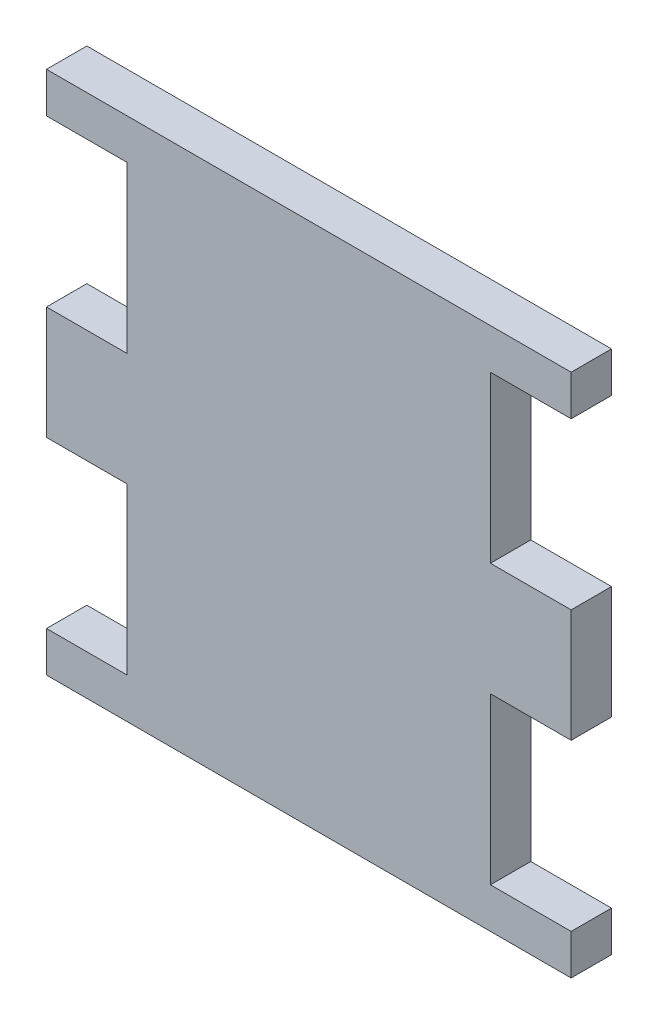
ISO-10303-21;
HEADER;
FILE_DESCRIPTION(('STEP AP214'),'2;1');
FILE_NAME('part.step','',(''),(''),'','','');
FILE_SCHEMA(('AUTOMOTIVE_DESIGN { 1 0 10303 214 1 1 1 1 }'));
ENDSEC;
DATA;
#1=APPLICATION_CONTEXT('core data for automotive mechanical design processes');
#2=APPLICATION_PROTOCOL_DEFINITION('international standard','automotive_design',2000,#1);
#3=PRODUCT_CONTEXT('',#1,'mechanical');
#4=PRODUCT('Part','Part','',(#3));
#5=PRODUCT_RELATED_PRODUCT_CATEGORY('part','',(#4));
#6=PRODUCT_DEFINITION_FORMATION('','',#4);
#7=PRODUCT_DEFINITION_CONTEXT('part definition',#1,'design');
#8=PRODUCT_DEFINITION('design','',#6,#7);
#9=PRODUCT_DEFINITION_SHAPE('','',#8);
#10=(LENGTH_UNIT() NAMED_UNIT(*) SI_UNIT(.MILLI.,.METRE.));
#11=(NAMED_UNIT(*) PLANE_ANGLE_UNIT() SI_UNIT($,.RADIAN.));
#12=(NAMED_UNIT(*) SI_UNIT($,.STERADIAN.) SOLID_ANGLE_UNIT());
#13=UNCERTAINTY_MEASURE_WITH_UNIT(LENGTH_MEASURE(1.E-05),#10,'distance_accuracy_value','');
#14=(GEOMETRIC_REPRESENTATION_CONTEXT(3) GLOBAL_UNCERTAINTY_ASSIGNED_CONTEXT((#13)) GLOBAL_UNIT_ASSIGNED_CONTEXT((#10,
#11,#12)) REPRESENTATION_CONTEXT('',''));
#15=CARTESIAN_POINT('',(0.,0.,0.));
#16=DIRECTION('',(0.,0.,1.));
#17=DIRECTION('',(1.,0.,0.));
#18=AXIS2_PLACEMENT_3D('',#15,#16,#17);
#19=CARTESIAN_POINT('',(130.,0.,10.));
#20=DIRECTION('',(-1.,0.,0.));
#21=DIRECTION('',(0.,-1.,0.));
#22=AXIS2_PLACEMENT_3D('',#19,#20,#21);
#23=PLANE('',#22);
#24=DIRECTION('',(0.,1.,0.));
#25=VECTOR('',#24,1.);
#26=CARTESIAN_POINT('',(130.,0.,0.));
#27=LINE('',#26,#25);
#28=CARTESIAN_POINT('',(130.,-130.,0.));
#29=VERTEX_POINT('',#28);
#30=CARTESIAN_POINT('',(130.,-120.,0.));
#31=VERTEX_POINT('',#30);
#32=EDGE_CURVE('E193',#29,#31,#27,.T.);
#33=ORIENTED_EDGE('',*,*,#32,.T.);
#34=DIRECTION('',(0.,0.,1.));
#35=VECTOR('',#34,1.);
#36=CARTESIAN_POINT('',(130.,-120.,0.));
#37=LINE('',#36,#35);
#38=CARTESIAN_POINT('',(130.,-120.,10.));
#39=VERTEX_POINT('',#38);
#40=EDGE_CURVE('E234',#31,#39,#37,.T.);
#41=ORIENTED_EDGE('',*,*,#40,.T.);
#42=DIRECTION('',(0.,1.,0.));
#43=VECTOR('',#42,1.);
#44=CARTESIAN_POINT('',(130.,0.,10.));
#45=LINE('',#44,#43);
#46=CARTESIAN_POINT('',(130.,-130.,10.));
#47=VERTEX_POINT('',#46);
#48=EDGE_CURVE('E217',#47,#39,#45,.T.);
#49=ORIENTED_EDGE('',*,*,#48,.F.);
#50=DIRECTION('',(0.,0.,-1.));
#51=VECTOR('',#50,1.);
#52=CARTESIAN_POINT('',(130.,-130.,10.));
#53=LINE('',#52,#51);
#54=EDGE_CURVE('E41',#47,#29,#53,.T.);
#55=ORIENTED_EDGE('',*,*,#54,.T.);
#56=EDGE_LOOP('',(#33,#41,#49,#55));
#57=FACE_BOUND('',#56,.T.);
#58=ADVANCED_FACE('F33',(#57),#23,.F.);
#59=CARTESIAN_POINT('',(130.,-79.,10.));
#60=VERTEX_POINT('',#59);
#61=CARTESIAN_POINT('',(130.,-51.,10.));
#62=VERTEX_POINT('',#61);
#63=EDGE_CURVE('E186',#60,#62,#45,.T.);
#64=ORIENTED_EDGE('',*,*,#63,.F.);
#65=DIRECTION('',(0.,0.,1.));
#66=VECTOR('',#65,1.);
#67=CARTESIAN_POINT('',(130.,-79.,0.));
#68=LINE('',#67,#66);
#69=CARTESIAN_POINT('',(130.,-79.,0.));
#70=VERTEX_POINT('',#69);
#71=EDGE_CURVE('E173',#70,#60,#68,.T.);
#72=ORIENTED_EDGE('',*,*,#71,.F.);
#73=CARTESIAN_POINT('',(130.,-51.,0.));
#74=VERTEX_POINT('',#73);
#75=EDGE_CURVE('E184',#70,#74,#27,.T.);
#76=ORIENTED_EDGE('',*,*,#75,.T.);
#77=DIRECTION('',(0.,0.,1.));
#78=VECTOR('',#77,1.);
#79=CARTESIAN_POINT('',(130.,-51.,0.));
#80=LINE('',#79,#78);
#81=EDGE_CURVE('E254',#74,#62,#80,.T.);
#82=ORIENTED_EDGE('',*,*,#81,.T.);
#83=EDGE_LOOP('',(#64,#72,#76,#82));
#84=FACE_BOUND('',#83,.T.);
#85=ADVANCED_FACE('F182',(#84),#23,.F.);
#86=CARTESIAN_POINT('',(0.,0.,10.));
#87=DIRECTION('',(1.,0.,0.));
#88=DIRECTION('',(0.,1.,0.));
#89=AXIS2_PLACEMENT_3D('',#86,#87,#88);
#90=PLANE('',#89);
#91=DIRECTION('',(0.,-1.,0.));
#92=VECTOR('',#91,1.);
#93=CARTESIAN_POINT('',(0.,0.,0.));
#94=LINE('',#93,#92);
#95=CARTESIAN_POINT('',(0.,-51.,0.));
#96=VERTEX_POINT('',#95);
#97=CARTESIAN_POINT('',(0.,-79.,0.));
#98=VERTEX_POINT('',#97);
#99=EDGE_CURVE('E324',#96,#98,#94,.T.);
#100=ORIENTED_EDGE('',*,*,#99,.T.);
#101=DIRECTION('',(0.,0.,1.));
#102=VECTOR('',#101,1.);
#103=CARTESIAN_POINT('',(0.,-79.,0.));
#104=LINE('',#103,#102);
#105=CARTESIAN_POINT('',(0.,-79.,10.));
#106=VERTEX_POINT('',#105);
#107=EDGE_CURVE('E279',#98,#106,#104,.T.);
#108=ORIENTED_EDGE('',*,*,#107,.T.);
#109=DIRECTION('',(0.,-1.,0.));
#110=VECTOR('',#109,1.);
#111=CARTESIAN_POINT('',(0.,0.,10.));
#112=LINE('',#111,#110);
#113=CARTESIAN_POINT('',(0.,-51.,10.));
#114=VERTEX_POINT('',#113);
#115=EDGE_CURVE('E318',#114,#106,#112,.T.);
#116=ORIENTED_EDGE('',*,*,#115,.F.);
#117=DIRECTION('',(0.,0.,1.));
#118=VECTOR('',#117,1.);
#119=CARTESIAN_POINT('',(0.,-51.,0.));
#120=LINE('',#119,#118);
#121=EDGE_CURVE('E298',#96,#114,#120,.T.);
#122=ORIENTED_EDGE('',*,*,#121,.F.);
#123=EDGE_LOOP('',(#100,#108,#116,#122));
#124=FACE_BOUND('',#123,.T.);
#125=ADVANCED_FACE('F346',(#124),#90,.F.);
#126=CARTESIAN_POINT('',(0.,0.,0.));
#127=VERTEX_POINT('',#126);
#128=CARTESIAN_POINT('',(0.,-10.,0.));
#129=VERTEX_POINT('',#128);
#130=EDGE_CURVE('E322',#127,#129,#94,.T.);
#131=ORIENTED_EDGE('',*,*,#130,.T.);
#132=DIRECTION('',(0.,0.,1.));
#133=VECTOR('',#132,1.);
#134=CARTESIAN_POINT('',(0.,-10.,0.));
#135=LINE('',#134,#133);
#136=CARTESIAN_POINT('',(0.,-10.,10.));
#137=VERTEX_POINT('',#136);
#138=EDGE_CURVE('E305',#129,#137,#135,.T.);
#139=ORIENTED_EDGE('',*,*,#138,.T.);
#140=CARTESIAN_POINT('',(0.,0.,10.));
#141=VERTEX_POINT('',#140);
#142=EDGE_CURVE('E314',#141,#137,#112,.T.);
#143=ORIENTED_EDGE('',*,*,#142,.F.);
#144=DIRECTION('',(0.,0.,-1.));
#145=VECTOR('',#144,1.);
#146=CARTESIAN_POINT('',(0.,0.,10.));
#147=LINE('',#146,#145);
#148=EDGE_CURVE('E204',#141,#127,#147,.T.);
#149=ORIENTED_EDGE('',*,*,#148,.T.);
#150=EDGE_LOOP('',(#131,#139,#143,#149));
#151=FACE_BOUND('',#150,.T.);
#152=ADVANCED_FACE('F365',(#151),#90,.F.);
#153=CARTESIAN_POINT('',(0.,-120.,10.));
#154=VERTEX_POINT('',#153);
#155=CARTESIAN_POINT('',(0.,-130.,10.));
#156=VERTEX_POINT('',#155);
#157=EDGE_CURVE('E203',#154,#156,#112,.T.);
#158=ORIENTED_EDGE('',*,*,#157,.F.);
#159=DIRECTION('',(0.,0.,1.));
#160=VECTOR('',#159,1.);
#161=CARTESIAN_POINT('',(0.,-120.,0.));
#162=LINE('',#161,#160);
#163=CARTESIAN_POINT('',(0.,-120.,0.));
#164=VERTEX_POINT('',#163);
#165=EDGE_CURVE('E272',#164,#154,#162,.T.);
#166=ORIENTED_EDGE('',*,*,#165,.F.);
#167=CARTESIAN_POINT('',(0.,-130.,0.));
#168=VERTEX_POINT('',#167);
#169=EDGE_CURVE('E308',#164,#168,#94,.T.);
#170=ORIENTED_EDGE('',*,*,#169,.T.);
#171=DIRECTION('',(0.,0.,-1.));
#172=VECTOR('',#171,1.);
#173=CARTESIAN_POINT('',(0.,-130.,10.));
#174=LINE('',#173,#172);
#175=EDGE_CURVE('E11',#156,#168,#174,.T.);
#176=ORIENTED_EDGE('',*,*,#175,.F.);
#177=EDGE_LOOP('',(#158,#166,#170,#176));
#178=FACE_BOUND('',#177,.T.);
#179=ADVANCED_FACE('F35',(#178),#90,.F.);
#180=CARTESIAN_POINT('',(0.,-130.,10.));
#181=DIRECTION('',(0.,1.,0.));
#182=DIRECTION('',(0.,0.,1.));
#183=AXIS2_PLACEMENT_3D('',#180,#181,#182);
#184=PLANE('',#183);
#185=DIRECTION('',(1.,0.,0.));
#186=VECTOR('',#185,1.);
#187=CARTESIAN_POINT('',(0.,-130.,0.));
#188=LINE('',#187,#186);
#189=EDGE_CURVE('E198',#168,#29,#188,.T.);
#190=ORIENTED_EDGE('',*,*,#189,.T.);
#191=ORIENTED_EDGE('',*,*,#54,.F.);
#192=DIRECTION('',(1.,0.,0.));
#193=VECTOR('',#192,1.);
#194=CARTESIAN_POINT('',(0.,-130.,10.));
#195=LINE('',#194,#193);
#196=EDGE_CURVE('E317',#156,#47,#195,.T.);
#197=ORIENTED_EDGE('',*,*,#196,.F.);
#198=ORIENTED_EDGE('',*,*,#175,.T.);
#199=EDGE_LOOP('',(#190,#191,#197,#198));
#200=FACE_BOUND('',#199,.T.);
#201=ADVANCED_FACE('F400',(#200),#184,.F.);
#202=CARTESIAN_POINT('',(130.,-9.99999999999998,10.));
#203=VERTEX_POINT('',#202);
#204=CARTESIAN_POINT('',(130.,0.,10.));
#205=VERTEX_POINT('',#204);
#206=EDGE_CURVE('E320',#203,#205,#45,.T.);
#207=ORIENTED_EDGE('',*,*,#206,.F.);
#208=DIRECTION('',(0.,0.,1.));
#209=VECTOR('',#208,1.);
#210=CARTESIAN_POINT('',(130.,-9.99999999999998,0.));
#211=LINE('',#210,#209);
#212=CARTESIAN_POINT('',(130.,-9.99999999999998,0.));
#213=VERTEX_POINT('',#212);
#214=EDGE_CURVE('E246',#213,#203,#211,.T.);
#215=ORIENTED_EDGE('',*,*,#214,.F.);
#216=CARTESIAN_POINT('',(130.,0.,0.));
#217=VERTEX_POINT('',#216);
#218=EDGE_CURVE('E194',#213,#217,#27,.T.);
#219=ORIENTED_EDGE('',*,*,#218,.T.);
#220=DIRECTION('',(0.,0.,-1.));
#221=VECTOR('',#220,1.);
#222=CARTESIAN_POINT('',(130.,0.,10.));
#223=LINE('',#222,#221);
#224=EDGE_CURVE('E207',#205,#217,#223,.T.);
#225=ORIENTED_EDGE('',*,*,#224,.F.);
#226=EDGE_LOOP('',(#207,#215,#219,#225));
#227=FACE_BOUND('',#226,.T.);
#228=ADVANCED_FACE('F376',(#227),#23,.F.);
#229=CARTESIAN_POINT('',(0.,0.,10.));
#230=DIRECTION('',(0.,-1.,0.));
#231=DIRECTION('',(0.,0.,-1.));
#232=AXIS2_PLACEMENT_3D('',#229,#230,#231);
#233=PLANE('',#232);
#234=DIRECTION('',(-1.,0.,0.));
#235=VECTOR('',#234,1.);
#236=CARTESIAN_POINT('',(0.,0.,0.));
#237=LINE('',#236,#235);
#238=EDGE_CURVE('E197',#217,#127,#237,.T.);
#239=ORIENTED_EDGE('',*,*,#238,.T.);
#240=ORIENTED_EDGE('',*,*,#148,.F.);
#241=DIRECTION('',(-1.,0.,0.));
#242=VECTOR('',#241,1.);
#243=CARTESIAN_POINT('',(0.,0.,10.));
#244=LINE('',#243,#242);
#245=EDGE_CURVE('E208',#205,#141,#244,.T.);
#246=ORIENTED_EDGE('',*,*,#245,.F.);
#247=ORIENTED_EDGE('',*,*,#224,.T.);
#248=EDGE_LOOP('',(#239,#240,#246,#247));
#249=FACE_BOUND('',#248,.T.);
#250=ADVANCED_FACE('F372',(#249),#233,.F.);
#251=CARTESIAN_POINT('',(0.,0.,10.));
#252=DIRECTION('',(0.,0.,1.));
#253=DIRECTION('',(1.,0.,0.));
#254=AXIS2_PLACEMENT_3D('',#251,#252,#253);
#255=PLANE('',#254);
#256=DIRECTION('',(1.,0.,0.));
#257=VECTOR('',#256,1.);
#258=CARTESIAN_POINT('',(130.,-120.,10.));
#259=LINE('',#258,#257);
#260=CARTESIAN_POINT('',(110.,-120.,10.));
#261=VERTEX_POINT('',#260);
#262=EDGE_CURVE('E178',#261,#39,#259,.T.);
#263=ORIENTED_EDGE('',*,*,#262,.F.);
#264=DIRECTION('',(0.,-1.,0.));
#265=VECTOR('',#264,1.);
#266=CARTESIAN_POINT('',(110.,-79.,10.));
#267=LINE('',#266,#265);
#268=CARTESIAN_POINT('',(110.,-79.,10.));
#269=VERTEX_POINT('',#268);
#270=EDGE_CURVE('E230',#269,#261,#267,.T.);
#271=ORIENTED_EDGE('',*,*,#270,.F.);
#272=DIRECTION('',(-1.,0.,0.));
#273=VECTOR('',#272,1.);
#274=CARTESIAN_POINT('',(130.,-79.,10.));
#275=LINE('',#274,#273);
#276=EDGE_CURVE('E228',#60,#269,#275,.T.);
#277=ORIENTED_EDGE('',*,*,#276,.F.);
#278=ORIENTED_EDGE('',*,*,#63,.T.);
#279=DIRECTION('',(1.,0.,0.));
#280=VECTOR('',#279,1.);
#281=CARTESIAN_POINT('',(130.,-51.,10.));
#282=LINE('',#281,#280);
#283=CARTESIAN_POINT('',(110.,-51.,10.));
#284=VERTEX_POINT('',#283);
#285=EDGE_CURVE('E243',#284,#62,#282,.T.);
#286=ORIENTED_EDGE('',*,*,#285,.F.);
#287=DIRECTION('',(0.,-1.,0.));
#288=VECTOR('',#287,1.);
#289=CARTESIAN_POINT('',(110.,-9.99999999999999,10.));
#290=LINE('',#289,#288);
#291=CARTESIAN_POINT('',(110.,-9.99999999999999,10.));
#292=VERTEX_POINT('',#291);
#293=EDGE_CURVE('E249',#292,#284,#290,.T.);
#294=ORIENTED_EDGE('',*,*,#293,.F.);
#295=DIRECTION('',(-1.,0.,0.));
#296=VECTOR('',#295,1.);
#297=CARTESIAN_POINT('',(130.,-9.99999999999998,10.));
#298=LINE('',#297,#296);
#299=EDGE_CURVE('E236',#203,#292,#298,.T.);
#300=ORIENTED_EDGE('',*,*,#299,.F.);
#301=ORIENTED_EDGE('',*,*,#206,.T.);
#302=ORIENTED_EDGE('',*,*,#245,.T.);
#303=ORIENTED_EDGE('',*,*,#142,.T.);
#304=DIRECTION('',(-1.,0.,0.));
#305=VECTOR('',#304,1.);
#306=CARTESIAN_POINT('',(0.,-10.,10.));
#307=LINE('',#306,#305);
#308=CARTESIAN_POINT('',(20.,-9.99999999999998,10.));
#309=VERTEX_POINT('',#308);
#310=EDGE_CURVE('E292',#309,#137,#307,.T.);
#311=ORIENTED_EDGE('',*,*,#310,.F.);
#312=DIRECTION('',(0.,1.,0.));
#313=VECTOR('',#312,1.);
#314=CARTESIAN_POINT('',(20.,-9.99999999999998,10.));
#315=LINE('',#314,#313);
#316=CARTESIAN_POINT('',(20.,-51.,10.));
#317=VERTEX_POINT('',#316);
#318=EDGE_CURVE('E301',#317,#309,#315,.T.);
#319=ORIENTED_EDGE('',*,*,#318,.F.);
#320=DIRECTION('',(1.,0.,0.));
#321=VECTOR('',#320,1.);
#322=CARTESIAN_POINT('',(0.,-51.,10.));
#323=LINE('',#322,#321);
#324=EDGE_CURVE('E282',#114,#317,#323,.T.);
#325=ORIENTED_EDGE('',*,*,#324,.F.);
#326=ORIENTED_EDGE('',*,*,#115,.T.);
#327=DIRECTION('',(-1.,0.,0.));
#328=VECTOR('',#327,1.);
#329=CARTESIAN_POINT('',(0.,-79.,10.));
#330=LINE('',#329,#328);
#331=CARTESIAN_POINT('',(20.,-79.,10.));
#332=VERTEX_POINT('',#331);
#333=EDGE_CURVE('E266',#332,#106,#330,.T.);
#334=ORIENTED_EDGE('',*,*,#333,.F.);
#335=DIRECTION('',(0.,1.,0.));
#336=VECTOR('',#335,1.);
#337=CARTESIAN_POINT('',(20.,-120.,10.));
#338=LINE('',#337,#336);
#339=CARTESIAN_POINT('',(20.,-120.,10.));
#340=VERTEX_POINT('',#339);
#341=EDGE_CURVE('E275',#340,#332,#338,.T.);
#342=ORIENTED_EDGE('',*,*,#341,.F.);
#343=DIRECTION('',(1.,0.,0.));
#344=VECTOR('',#343,1.);
#345=CARTESIAN_POINT('',(0.,-120.,10.));
#346=LINE('',#345,#344);
#347=EDGE_CURVE('E256',#154,#340,#346,.T.);
#348=ORIENTED_EDGE('',*,*,#347,.F.);
#349=ORIENTED_EDGE('',*,*,#157,.T.);
#350=ORIENTED_EDGE('',*,*,#196,.T.);
#351=ORIENTED_EDGE('',*,*,#48,.T.);
#352=EDGE_LOOP('',(#263,#271,#277,#278,#286,#294,#300,#301,#302,#303,#311,#319,#325,#326,#334,
#342,#348,#349,#350,#351));
#353=FACE_BOUND('',#352,.T.);
#354=ADVANCED_FACE('F356',(#353),#255,.T.);
#355=CARTESIAN_POINT('',(0.,0.,0.));
#356=DIRECTION('',(0.,0.,1.));
#357=DIRECTION('',(1.,0.,0.));
#358=AXIS2_PLACEMENT_3D('',#355,#356,#357);
#359=PLANE('',#358);
#360=DIRECTION('',(0.,-1.,0.));
#361=VECTOR('',#360,1.);
#362=CARTESIAN_POINT('',(110.,-79.,0.));
#363=LINE('',#362,#361);
#364=CARTESIAN_POINT('',(110.,-79.,0.));
#365=VERTEX_POINT('',#364);
#366=CARTESIAN_POINT('',(110.,-120.,0.));
#367=VERTEX_POINT('',#366);
#368=EDGE_CURVE('E48',#365,#367,#363,.T.);
#369=ORIENTED_EDGE('',*,*,#368,.T.);
#370=DIRECTION('',(1.,0.,0.));
#371=VECTOR('',#370,1.);
#372=CARTESIAN_POINT('',(130.,-120.,0.));
#373=LINE('',#372,#371);
#374=EDGE_CURVE('E187',#367,#31,#373,.T.);
#375=ORIENTED_EDGE('',*,*,#374,.T.);
#376=ORIENTED_EDGE('',*,*,#32,.F.);
#377=ORIENTED_EDGE('',*,*,#189,.F.);
#378=ORIENTED_EDGE('',*,*,#169,.F.);
#379=DIRECTION('',(1.,0.,0.));
#380=VECTOR('',#379,1.);
#381=CARTESIAN_POINT('',(0.,-120.,0.));
#382=LINE('',#381,#380);
#383=CARTESIAN_POINT('',(20.,-120.,0.));
#384=VERTEX_POINT('',#383);
#385=EDGE_CURVE('E262',#164,#384,#382,.T.);
#386=ORIENTED_EDGE('',*,*,#385,.T.);
#387=DIRECTION('',(0.,1.,0.));
#388=VECTOR('',#387,1.);
#389=CARTESIAN_POINT('',(20.,-120.,0.));
#390=LINE('',#389,#388);
#391=CARTESIAN_POINT('',(20.,-79.,0.));
#392=VERTEX_POINT('',#391);
#393=EDGE_CURVE('E265',#384,#392,#390,.T.);
#394=ORIENTED_EDGE('',*,*,#393,.T.);
#395=DIRECTION('',(-1.,0.,0.));
#396=VECTOR('',#395,1.);
#397=CARTESIAN_POINT('',(0.,-79.,0.));
#398=LINE('',#397,#396);
#399=EDGE_CURVE('E269',#392,#98,#398,.T.);
#400=ORIENTED_EDGE('',*,*,#399,.T.);
#401=ORIENTED_EDGE('',*,*,#99,.F.);
#402=DIRECTION('',(1.,0.,0.));
#403=VECTOR('',#402,1.);
#404=CARTESIAN_POINT('',(0.,-51.,0.));
#405=LINE('',#404,#403);
#406=CARTESIAN_POINT('',(20.,-51.,0.));
#407=VERTEX_POINT('',#406);
#408=EDGE_CURVE('E288',#96,#407,#405,.T.);
#409=ORIENTED_EDGE('',*,*,#408,.T.);
#410=DIRECTION('',(0.,1.,0.));
#411=VECTOR('',#410,1.);
#412=CARTESIAN_POINT('',(20.,-9.99999999999998,0.));
#413=LINE('',#412,#411);
#414=CARTESIAN_POINT('',(20.,-9.99999999999998,0.));
#415=VERTEX_POINT('',#414);
#416=EDGE_CURVE('E291',#407,#415,#413,.T.);
#417=ORIENTED_EDGE('',*,*,#416,.T.);
#418=DIRECTION('',(-1.,0.,0.));
#419=VECTOR('',#418,1.);
#420=CARTESIAN_POINT('',(0.,-10.,0.));
#421=LINE('',#420,#419);
#422=EDGE_CURVE('E295',#415,#129,#421,.T.);
#423=ORIENTED_EDGE('',*,*,#422,.T.);
#424=ORIENTED_EDGE('',*,*,#130,.F.);
#425=ORIENTED_EDGE('',*,*,#238,.F.);
#426=ORIENTED_EDGE('',*,*,#218,.F.);
#427=DIRECTION('',(-1.,0.,0.));
#428=VECTOR('',#427,1.);
#429=CARTESIAN_POINT('',(130.,-9.99999999999998,0.));
#430=LINE('',#429,#428);
#431=CARTESIAN_POINT('',(110.,-9.99999999999999,0.));
#432=VERTEX_POINT('',#431);
#433=EDGE_CURVE('E240',#213,#432,#430,.T.);
#434=ORIENTED_EDGE('',*,*,#433,.T.);
#435=DIRECTION('',(0.,-1.,0.));
#436=VECTOR('',#435,1.);
#437=CARTESIAN_POINT('',(110.,-9.99999999999999,0.));
#438=LINE('',#437,#436);
#439=CARTESIAN_POINT('',(110.,-51.,0.));
#440=VERTEX_POINT('',#439);
#441=EDGE_CURVE('E56',#432,#440,#438,.T.);
#442=ORIENTED_EDGE('',*,*,#441,.T.);
#443=DIRECTION('',(1.,0.,0.));
#444=VECTOR('',#443,1.);
#445=CARTESIAN_POINT('',(130.,-51.,0.));
#446=LINE('',#445,#444);
#447=EDGE_CURVE('E192',#440,#74,#446,.T.);
#448=ORIENTED_EDGE('',*,*,#447,.T.);
#449=ORIENTED_EDGE('',*,*,#75,.F.);
#450=DIRECTION('',(-1.,0.,0.));
#451=VECTOR('',#450,1.);
#452=CARTESIAN_POINT('',(130.,-79.,0.));
#453=LINE('',#452,#451);
#454=EDGE_CURVE('E169',#70,#365,#453,.T.);
#455=ORIENTED_EDGE('',*,*,#454,.T.);
#456=EDGE_LOOP('',(#369,#375,#376,#377,#378,#386,#394,#400,#401,#409,#417,#423,#424,#425,#426,
#434,#442,#448,#449,#455));
#457=FACE_BOUND('',#456,.T.);
#458=ADVANCED_FACE('F190',(#457),#359,.F.);
#459=CARTESIAN_POINT('',(0.,-10.,0.));
#460=DIRECTION('',(0.,1.,0.));
#461=DIRECTION('',(-1.,0.,0.));
#462=AXIS2_PLACEMENT_3D('',#459,#460,#461);
#463=PLANE('',#462);
#464=ORIENTED_EDGE('',*,*,#310,.T.);
#465=ORIENTED_EDGE('',*,*,#138,.F.);
#466=ORIENTED_EDGE('',*,*,#422,.F.);
#467=DIRECTION('',(0.,0.,1.));
#468=VECTOR('',#467,1.);
#469=CARTESIAN_POINT('',(20.,-9.99999999999998,0.));
#470=LINE('',#469,#468);
#471=EDGE_CURVE('E309',#415,#309,#470,.T.);
#472=ORIENTED_EDGE('',*,*,#471,.T.);
#473=EDGE_LOOP('',(#464,#465,#466,#472));
#474=FACE_BOUND('',#473,.T.);
#475=ADVANCED_FACE('F363',(#474),#463,.F.);
#476=CARTESIAN_POINT('',(20.,-9.99999999999998,0.));
#477=DIRECTION('',(1.,0.,0.));
#478=DIRECTION('',(0.,1.,0.));
#479=AXIS2_PLACEMENT_3D('',#476,#477,#478);
#480=PLANE('',#479);
#481=ORIENTED_EDGE('',*,*,#318,.T.);
#482=ORIENTED_EDGE('',*,*,#471,.F.);
#483=ORIENTED_EDGE('',*,*,#416,.F.);
#484=DIRECTION('',(0.,0.,1.));
#485=VECTOR('',#484,1.);
#486=CARTESIAN_POINT('',(20.,-51.,0.));
#487=LINE('',#486,#485);
#488=EDGE_CURVE('E311',#407,#317,#487,.T.);
#489=ORIENTED_EDGE('',*,*,#488,.T.);
#490=EDGE_LOOP('',(#481,#482,#483,#489));
#491=FACE_BOUND('',#490,.T.);
#492=ADVANCED_FACE('F359',(#491),#480,.F.);
#493=CARTESIAN_POINT('',(0.,-51.,0.));
#494=DIRECTION('',(0.,-1.,0.));
#495=DIRECTION('',(1.,0.,0.));
#496=AXIS2_PLACEMENT_3D('',#493,#494,#495);
#497=PLANE('',#496);
#498=ORIENTED_EDGE('',*,*,#324,.T.);
#499=ORIENTED_EDGE('',*,*,#488,.F.);
#500=ORIENTED_EDGE('',*,*,#408,.F.);
#501=ORIENTED_EDGE('',*,*,#121,.T.);
#502=EDGE_LOOP('',(#498,#499,#500,#501));
#503=FACE_BOUND('',#502,.T.);
#504=ADVANCED_FACE('F351',(#503),#497,.F.);
#505=CARTESIAN_POINT('',(0.,-79.,0.));
#506=DIRECTION('',(0.,1.,0.));
#507=DIRECTION('',(0.,0.,1.));
#508=AXIS2_PLACEMENT_3D('',#505,#506,#507);
#509=PLANE('',#508);
#510=ORIENTED_EDGE('',*,*,#333,.T.);
#511=ORIENTED_EDGE('',*,*,#107,.F.);
#512=ORIENTED_EDGE('',*,*,#399,.F.);
#513=DIRECTION('',(0.,0.,1.));
#514=VECTOR('',#513,1.);
#515=CARTESIAN_POINT('',(20.,-79.,0.));
#516=LINE('',#515,#514);
#517=EDGE_CURVE('E283',#392,#332,#516,.T.);
#518=ORIENTED_EDGE('',*,*,#517,.T.);
#519=EDGE_LOOP('',(#510,#511,#512,#518));
#520=FACE_BOUND('',#519,.T.);
#521=ADVANCED_FACE('F342',(#520),#509,.F.);
#522=CARTESIAN_POINT('',(20.,-120.,0.));
#523=DIRECTION('',(1.,0.,0.));
#524=DIRECTION('',(0.,0.,-1.));
#525=AXIS2_PLACEMENT_3D('',#522,#523,#524);
#526=PLANE('',#525);
#527=ORIENTED_EDGE('',*,*,#341,.T.);
#528=ORIENTED_EDGE('',*,*,#517,.F.);
#529=ORIENTED_EDGE('',*,*,#393,.F.);
#530=DIRECTION('',(0.,0.,1.));
#531=VECTOR('',#530,1.);
#532=CARTESIAN_POINT('',(20.,-120.,0.));
#533=LINE('',#532,#531);
#534=EDGE_CURVE('E285',#384,#340,#533,.T.);
#535=ORIENTED_EDGE('',*,*,#534,.T.);
#536=EDGE_LOOP('',(#527,#528,#529,#535));
#537=FACE_BOUND('',#536,.T.);
#538=ADVANCED_FACE('F338',(#537),#526,.F.);
#539=CARTESIAN_POINT('',(0.,-120.,0.));
#540=DIRECTION('',(0.,-1.,0.));
#541=DIRECTION('',(0.,0.,-1.));
#542=AXIS2_PLACEMENT_3D('',#539,#540,#541);
#543=PLANE('',#542);
#544=ORIENTED_EDGE('',*,*,#347,.T.);
#545=ORIENTED_EDGE('',*,*,#534,.F.);
#546=ORIENTED_EDGE('',*,*,#385,.F.);
#547=ORIENTED_EDGE('',*,*,#165,.T.);
#548=EDGE_LOOP('',(#544,#545,#546,#547));
#549=FACE_BOUND('',#548,.T.);
#550=ADVANCED_FACE('F334',(#549),#543,.F.);
#551=CARTESIAN_POINT('',(130.,-51.,0.));
#552=DIRECTION('',(0.,-1.,0.));
#553=DIRECTION('',(1.,0.,0.));
#554=AXIS2_PLACEMENT_3D('',#551,#552,#553);
#555=PLANE('',#554);
#556=ORIENTED_EDGE('',*,*,#285,.T.);
#557=ORIENTED_EDGE('',*,*,#81,.F.);
#558=ORIENTED_EDGE('',*,*,#447,.F.);
#559=DIRECTION('',(0.,0.,1.));
#560=VECTOR('',#559,1.);
#561=CARTESIAN_POINT('',(110.,-51.,0.));
#562=LINE('',#561,#560);
#563=EDGE_CURVE('E257',#440,#284,#562,.T.);
#564=ORIENTED_EDGE('',*,*,#563,.T.);
#565=EDGE_LOOP('',(#556,#557,#558,#564));
#566=FACE_BOUND('',#565,.T.);
#567=ADVANCED_FACE('F383',(#566),#555,.F.);
#568=CARTESIAN_POINT('',(110.,-9.99999999999999,0.));
#569=DIRECTION('',(-1.,0.,0.));
#570=DIRECTION('',(0.,0.,1.));
#571=AXIS2_PLACEMENT_3D('',#568,#569,#570);
#572=PLANE('',#571);
#573=ORIENTED_EDGE('',*,*,#293,.T.);
#574=ORIENTED_EDGE('',*,*,#563,.F.);
#575=ORIENTED_EDGE('',*,*,#441,.F.);
#576=DIRECTION('',(0.,0.,1.));
#577=VECTOR('',#576,1.);
#578=CARTESIAN_POINT('',(110.,-9.99999999999999,0.));
#579=LINE('',#578,#577);
#580=EDGE_CURVE('E259',#432,#292,#579,.T.);
#581=ORIENTED_EDGE('',*,*,#580,.T.);
#582=EDGE_LOOP('',(#573,#574,#575,#581));
#583=FACE_BOUND('',#582,.T.);
#584=ADVANCED_FACE('F381',(#583),#572,.F.);
#585=CARTESIAN_POINT('',(130.,-9.99999999999998,0.));
#586=DIRECTION('',(0.,1.,0.));
#587=DIRECTION('',(-1.,0.,0.));
#588=AXIS2_PLACEMENT_3D('',#585,#586,#587);
#589=PLANE('',#588);
#590=ORIENTED_EDGE('',*,*,#299,.T.);
#591=ORIENTED_EDGE('',*,*,#580,.F.);
#592=ORIENTED_EDGE('',*,*,#433,.F.);
#593=ORIENTED_EDGE('',*,*,#214,.T.);
#594=EDGE_LOOP('',(#590,#591,#592,#593));
#595=FACE_BOUND('',#594,.T.);
#596=ADVANCED_FACE('F378',(#595),#589,.F.);
#597=CARTESIAN_POINT('',(130.,-120.,0.));
#598=DIRECTION('',(0.,-1.,0.));
#599=DIRECTION('',(1.,0.,0.));
#600=AXIS2_PLACEMENT_3D('',#597,#598,#599);
#601=PLANE('',#600);
#602=ORIENTED_EDGE('',*,*,#262,.T.);
#603=ORIENTED_EDGE('',*,*,#40,.F.);
#604=ORIENTED_EDGE('',*,*,#374,.F.);
#605=DIRECTION('',(0.,0.,1.));
#606=VECTOR('',#605,1.);
#607=CARTESIAN_POINT('',(110.,-120.,0.));
#608=LINE('',#607,#606);
#609=EDGE_CURVE('E237',#367,#261,#608,.T.);
#610=ORIENTED_EDGE('',*,*,#609,.T.);
#611=EDGE_LOOP('',(#602,#603,#604,#610));
#612=FACE_BOUND('',#611,.T.);
#613=ADVANCED_FACE('F409',(#612),#601,.F.);
#614=CARTESIAN_POINT('',(110.,-79.,0.));
#615=DIRECTION('',(-1.,0.,0.));
#616=DIRECTION('',(0.,-1.,0.));
#617=AXIS2_PLACEMENT_3D('',#614,#615,#616);
#618=PLANE('',#617);
#619=ORIENTED_EDGE('',*,*,#270,.T.);
#620=ORIENTED_EDGE('',*,*,#609,.F.);
#621=ORIENTED_EDGE('',*,*,#368,.F.);
#622=DIRECTION('',(0.,0.,1.));
#623=VECTOR('',#622,1.);
#624=CARTESIAN_POINT('',(110.,-79.,0.));
#625=LINE('',#624,#623);
#626=EDGE_CURVE('E175',#365,#269,#625,.T.);
#627=ORIENTED_EDGE('',*,*,#626,.T.);
#628=EDGE_LOOP('',(#619,#620,#621,#627));
#629=FACE_BOUND('',#628,.T.);
#630=ADVANCED_FACE('F410',(#629),#618,.F.);
#631=CARTESIAN_POINT('',(130.,-79.,0.));
#632=DIRECTION('',(0.,1.,0.));
#633=DIRECTION('',(-1.,0.,0.));
#634=AXIS2_PLACEMENT_3D('',#631,#632,#633);
#635=PLANE('',#634);
#636=ORIENTED_EDGE('',*,*,#276,.T.);
#637=ORIENTED_EDGE('',*,*,#626,.F.);
#638=ORIENTED_EDGE('',*,*,#454,.F.);
#639=ORIENTED_EDGE('',*,*,#71,.T.);
#640=EDGE_LOOP('',(#636,#637,#638,#639));
#641=FACE_BOUND('',#640,.T.);
#642=ADVANCED_FACE('F172',(#641),#635,.F.);
#643=CLOSED_SHELL('',(#58,#85,#125,#152,#179,#201,#228,#250,#354,#458,#475,#492,#504,#521,#538,
#550,#567,#584,#596,#613,#630,#642));
#644=MANIFOLD_SOLID_BREP('B2',#643);
#645=ADVANCED_BREP_SHAPE_REPRESENTATION('',(#18,#644),#14);
#646=SHAPE_DEFINITION_REPRESENTATION(#9,#645);
ENDSEC;
END-ISO-10303-21;
